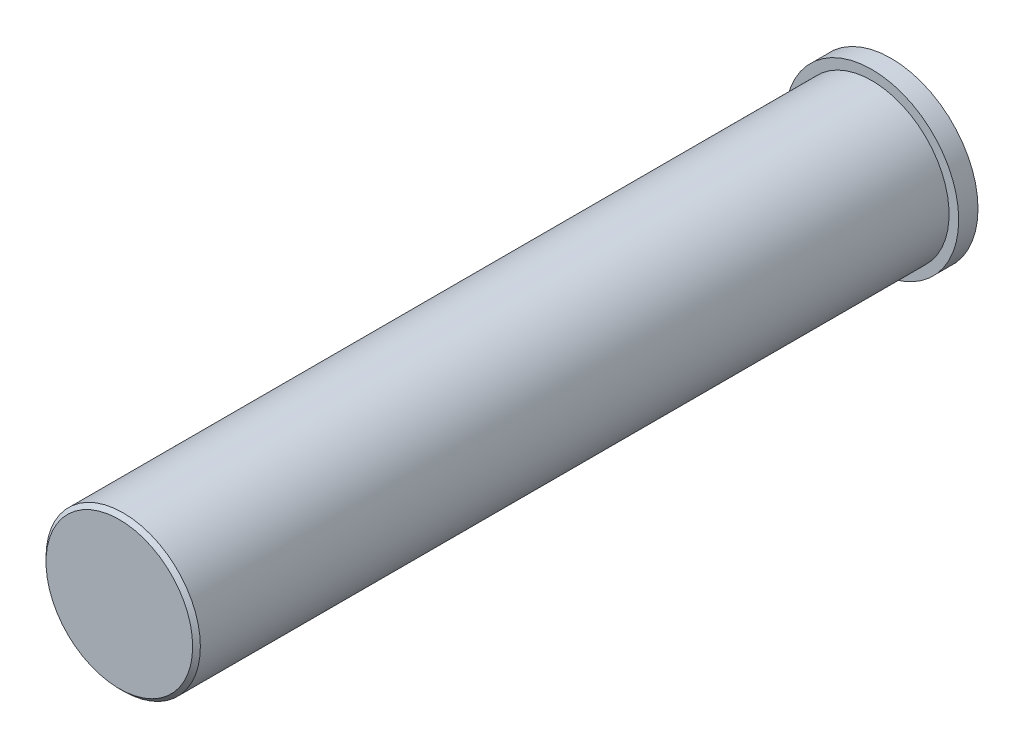
ISO-10303-21;
HEADER;
FILE_DESCRIPTION(('STEP AP214'),'2;1');
FILE_NAME('part.step','',(''),(''),'','','');
FILE_SCHEMA(('AUTOMOTIVE_DESIGN { 1 0 10303 214 1 1 1 1 }'));
ENDSEC;
DATA;
#1=APPLICATION_CONTEXT('core data for automotive mechanical design processes');
#2=APPLICATION_PROTOCOL_DEFINITION('international standard','automotive_design',2000,#1);
#3=PRODUCT_CONTEXT('',#1,'mechanical');
#4=PRODUCT('Part','Part','',(#3));
#5=PRODUCT_RELATED_PRODUCT_CATEGORY('part','',(#4));
#6=PRODUCT_DEFINITION_FORMATION('','',#4);
#7=PRODUCT_DEFINITION_CONTEXT('part definition',#1,'design');
#8=PRODUCT_DEFINITION('design','',#6,#7);
#9=PRODUCT_DEFINITION_SHAPE('','',#8);
#10=(LENGTH_UNIT() NAMED_UNIT(*) SI_UNIT(.MILLI.,.METRE.));
#11=(NAMED_UNIT(*) PLANE_ANGLE_UNIT() SI_UNIT($,.RADIAN.));
#12=(NAMED_UNIT(*) SI_UNIT($,.STERADIAN.) SOLID_ANGLE_UNIT());
#13=UNCERTAINTY_MEASURE_WITH_UNIT(LENGTH_MEASURE(1.E-05),#10,'distance_accuracy_value','');
#14=(GEOMETRIC_REPRESENTATION_CONTEXT(3) GLOBAL_UNCERTAINTY_ASSIGNED_CONTEXT((#13)) GLOBAL_UNIT_ASSIGNED_CONTEXT((#10,
#11,#12)) REPRESENTATION_CONTEXT('',''));
#15=CARTESIAN_POINT('',(0.,0.,0.));
#16=DIRECTION('',(0.,0.,1.));
#17=DIRECTION('',(1.,0.,0.));
#18=AXIS2_PLACEMENT_3D('',#15,#16,#17);
#19=CARTESIAN_POINT('',(0.,0.,20.));
#20=DIRECTION('',(0.,0.,-1.));
#21=DIRECTION('',(-1.,0.,0.));
#22=AXIS2_PLACEMENT_3D('',#19,#20,#21);
#23=CYLINDRICAL_SURFACE('',#22,2.);
#24=CARTESIAN_POINT('',(0.,0.,19.9));
#25=DIRECTION('',(0.,0.,1.));
#26=DIRECTION('',(1.,0.,0.));
#27=AXIS2_PLACEMENT_3D('',#24,#25,#26);
#28=CIRCLE('',#27,2.);
#29=CARTESIAN_POINT('',(2.,0.,19.9));
#30=VERTEX_POINT('',#29);
#31=EDGE_CURVE('E10',#30,#30,#28,.F.);
#32=ORIENTED_EDGE('',*,*,#31,.T.);
#33=EDGE_LOOP('',(#32));
#34=FACE_BOUND('',#33,.T.);
#35=CARTESIAN_POINT('',(0.,0.,0.5));
#36=DIRECTION('',(0.,0.,-1.));
#37=DIRECTION('',(-1.,0.,0.));
#38=AXIS2_PLACEMENT_3D('',#35,#36,#37);
#39=CIRCLE('',#38,2.);
#40=CARTESIAN_POINT('',(-2.,0.,0.5));
#41=VERTEX_POINT('',#40);
#42=EDGE_CURVE('E45',#41,#41,#39,.T.);
#43=ORIENTED_EDGE('',*,*,#42,.F.);
#44=EDGE_LOOP('',(#43));
#45=FACE_BOUND('',#44,.T.);
#46=ADVANCED_FACE('F33',(#34,#45),#23,.T.);
#47=CARTESIAN_POINT('',(0.,0.,20.));
#48=DIRECTION('',(0.,0.,1.));
#49=DIRECTION('',(1.,0.,0.));
#50=AXIS2_PLACEMENT_3D('',#47,#48,#49);
#51=PLANE('',#50);
#52=CARTESIAN_POINT('',(0.,0.,20.));
#53=DIRECTION('',(0.,0.,1.));
#54=DIRECTION('',(1.,0.,0.));
#55=AXIS2_PLACEMENT_3D('',#52,#53,#54);
#56=CIRCLE('',#55,1.9);
#57=CARTESIAN_POINT('',(1.9,0.,20.));
#58=VERTEX_POINT('',#57);
#59=EDGE_CURVE('E41',#58,#58,#56,.T.);
#60=ORIENTED_EDGE('',*,*,#59,.T.);
#61=EDGE_LOOP('',(#60));
#62=FACE_BOUND('',#61,.T.);
#63=ADVANCED_FACE('F81',(#62),#51,.T.);
#64=CARTESIAN_POINT('',(0.,0.,0.5));
#65=DIRECTION('',(0.,0.,-1.));
#66=DIRECTION('',(-1.,0.,0.));
#67=AXIS2_PLACEMENT_3D('',#64,#65,#66);
#68=CYLINDRICAL_SURFACE('',#67,2.25);
#69=CARTESIAN_POINT('',(0.,0.,0.5));
#70=DIRECTION('',(0.,0.,-1.));
#71=DIRECTION('',(-1.,0.,0.));
#72=AXIS2_PLACEMENT_3D('',#69,#70,#71);
#73=CIRCLE('',#72,2.25);
#74=CARTESIAN_POINT('',(-2.25,0.,0.5));
#75=VERTEX_POINT('',#74);
#76=EDGE_CURVE('E49',#75,#75,#73,.T.);
#77=ORIENTED_EDGE('',*,*,#76,.T.);
#78=EDGE_LOOP('',(#77));
#79=FACE_BOUND('',#78,.T.);
#80=CARTESIAN_POINT('',(0.,0.,0.));
#81=DIRECTION('',(0.,0.,-1.));
#82=DIRECTION('',(-1.,0.,0.));
#83=AXIS2_PLACEMENT_3D('',#80,#81,#82);
#84=CIRCLE('',#83,2.25);
#85=CARTESIAN_POINT('',(-2.25,0.,0.));
#86=VERTEX_POINT('',#85);
#87=EDGE_CURVE('E52',#86,#86,#84,.T.);
#88=ORIENTED_EDGE('',*,*,#87,.F.);
#89=EDGE_LOOP('',(#88));
#90=FACE_BOUND('',#89,.T.);
#91=ADVANCED_FACE('F79',(#79,#90),#68,.T.);
#92=CARTESIAN_POINT('',(0.,0.,0.5));
#93=DIRECTION('',(0.,0.,-1.));
#94=DIRECTION('',(-1.,0.,0.));
#95=AXIS2_PLACEMENT_3D('',#92,#93,#94);
#96=PLANE('',#95);
#97=ORIENTED_EDGE('',*,*,#42,.T.);
#98=EDGE_LOOP('',(#97));
#99=FACE_BOUND('',#98,.T.);
#100=ORIENTED_EDGE('',*,*,#76,.F.);
#101=EDGE_LOOP('',(#100));
#102=FACE_BOUND('',#101,.T.);
#103=ADVANCED_FACE('F75',(#99,#102),#96,.F.);
#104=CARTESIAN_POINT('',(0.,0.,0.));
#105=DIRECTION('',(0.,0.,1.));
#106=DIRECTION('',(1.,0.,0.));
#107=AXIS2_PLACEMENT_3D('',#104,#105,#106);
#108=PLANE('',#107);
#109=CARTESIAN_POINT('',(0.,0.,0.));
#110=DIRECTION('',(0.,0.,-1.));
#111=DIRECTION('',(-1.,0.,0.));
#112=AXIS2_PLACEMENT_3D('',#109,#110,#111);
#113=CIRCLE('',#112,1.5);
#114=CARTESIAN_POINT('',(-1.5,0.,0.));
#115=VERTEX_POINT('',#114);
#116=EDGE_CURVE('E58',#115,#115,#113,.T.);
#117=ORIENTED_EDGE('',*,*,#116,.F.);
#118=EDGE_LOOP('',(#117));
#119=FACE_BOUND('',#118,.T.);
#120=ORIENTED_EDGE('',*,*,#87,.T.);
#121=EDGE_LOOP('',(#120));
#122=FACE_BOUND('',#121,.T.);
#123=ADVANCED_FACE('F69',(#119,#122),#108,.F.);
#124=CARTESIAN_POINT('',(0.,0.,8.));
#125=DIRECTION('',(0.,0.,-1.));
#126=DIRECTION('',(-1.,0.,0.));
#127=AXIS2_PLACEMENT_3D('',#124,#125,#126);
#128=CYLINDRICAL_SURFACE('',#127,1.5);
#129=CARTESIAN_POINT('',(0.,0.,8.));
#130=DIRECTION('',(0.,0.,-1.));
#131=DIRECTION('',(-1.,0.,0.));
#132=AXIS2_PLACEMENT_3D('',#129,#130,#131);
#133=CIRCLE('',#132,1.5);
#134=CARTESIAN_POINT('',(-1.5,0.,8.));
#135=VERTEX_POINT('',#134);
#136=EDGE_CURVE('E55',#135,#135,#133,.T.);
#137=ORIENTED_EDGE('',*,*,#136,.F.);
#138=EDGE_LOOP('',(#137));
#139=FACE_BOUND('',#138,.T.);
#140=ORIENTED_EDGE('',*,*,#116,.T.);
#141=EDGE_LOOP('',(#140));
#142=FACE_BOUND('',#141,.T.);
#143=ADVANCED_FACE('F66',(#139,#142),#128,.F.);
#144=CARTESIAN_POINT('',(0.,0.,8.));
#145=DIRECTION('',(0.,0.,-1.));
#146=DIRECTION('',(-1.,0.,0.));
#147=AXIS2_PLACEMENT_3D('',#144,#145,#146);
#148=PLANE('',#147);
#149=ORIENTED_EDGE('',*,*,#136,.T.);
#150=EDGE_LOOP('',(#149));
#151=FACE_BOUND('',#150,.T.);
#152=ADVANCED_FACE('F64',(#151),#148,.T.);
#153=CARTESIAN_POINT('',(0.,0.,20.));
#154=DIRECTION('',(0.,0.,-1.));
#155=DIRECTION('',(-1.,0.,0.));
#156=AXIS2_PLACEMENT_3D('',#153,#154,#155);
#157=CONICAL_SURFACE('',#156,1.9,0.785398163397466);
#158=ORIENTED_EDGE('',*,*,#31,.F.);
#159=EDGE_LOOP('',(#158));
#160=FACE_BOUND('',#159,.T.);
#161=ORIENTED_EDGE('',*,*,#59,.F.);
#162=EDGE_LOOP('',(#161));
#163=FACE_BOUND('',#162,.T.);
#164=ADVANCED_FACE('F36',(#160,#163),#157,.T.);
#165=CLOSED_SHELL('',(#46,#63,#91,#103,#123,#143,#152,#164));
#166=MANIFOLD_SOLID_BREP('B2',#165);
#167=ADVANCED_BREP_SHAPE_REPRESENTATION('',(#18,#166),#14);
#168=SHAPE_DEFINITION_REPRESENTATION(#9,#167);
ENDSEC;
END-ISO-10303-21;
